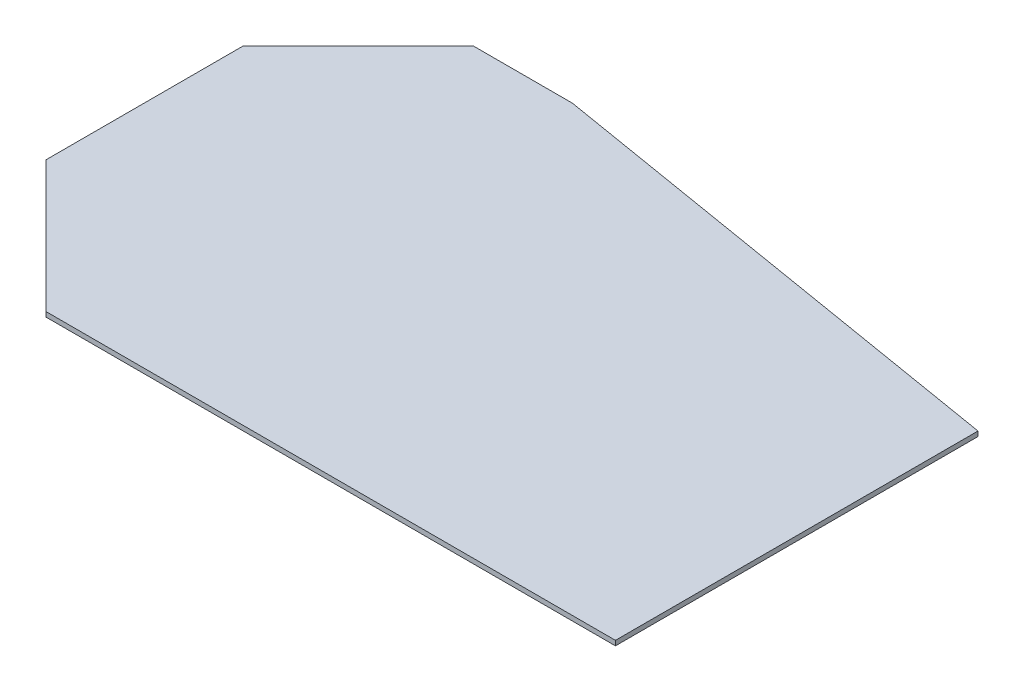
ISO-10303-21;
HEADER;
FILE_DESCRIPTION(('STEP AP214'),'2;1');
FILE_NAME('part.step','',(''),(''),'','','');
FILE_SCHEMA(('AUTOMOTIVE_DESIGN { 1 0 10303 214 1 1 1 1 }'));
ENDSEC;
DATA;
#1=APPLICATION_CONTEXT('core data for automotive mechanical design processes');
#2=APPLICATION_PROTOCOL_DEFINITION('international standard','automotive_design',2000,#1);
#3=PRODUCT_CONTEXT('',#1,'mechanical');
#4=PRODUCT('Part','Part','',(#3));
#5=PRODUCT_RELATED_PRODUCT_CATEGORY('part','',(#4));
#6=PRODUCT_DEFINITION_FORMATION('','',#4);
#7=PRODUCT_DEFINITION_CONTEXT('part definition',#1,'design');
#8=PRODUCT_DEFINITION('design','',#6,#7);
#9=PRODUCT_DEFINITION_SHAPE('','',#8);
#10=(LENGTH_UNIT() NAMED_UNIT(*) SI_UNIT(.MILLI.,.METRE.));
#11=(NAMED_UNIT(*) PLANE_ANGLE_UNIT() SI_UNIT($,.RADIAN.));
#12=(NAMED_UNIT(*) SI_UNIT($,.STERADIAN.) SOLID_ANGLE_UNIT());
#13=UNCERTAINTY_MEASURE_WITH_UNIT(LENGTH_MEASURE(1.E-05),#10,'distance_accuracy_value','');
#14=(GEOMETRIC_REPRESENTATION_CONTEXT(3) GLOBAL_UNCERTAINTY_ASSIGNED_CONTEXT((#13)) GLOBAL_UNIT_ASSIGNED_CONTEXT((#10,
#11,#12)) REPRESENTATION_CONTEXT('',''));
#15=CARTESIAN_POINT('',(0.,0.,0.));
#16=DIRECTION('',(0.,0.,1.));
#17=DIRECTION('',(1.,0.,0.));
#18=AXIS2_PLACEMENT_3D('',#15,#16,#17);
#19=CARTESIAN_POINT('',(0.,3.,-283.));
#20=DIRECTION('',(0.,0.,-1.));
#21=DIRECTION('',(-1.,0.,0.));
#22=AXIS2_PLACEMENT_3D('',#19,#20,#21);
#23=PLANE('',#22);
#24=DIRECTION('',(1.,0.,0.));
#25=VECTOR('',#24,1.);
#26=CARTESIAN_POINT('',(0.,0.,-283.));
#27=LINE('',#26,#25);
#28=CARTESIAN_POINT('',(103.75735931288,0.,-283.));
#29=VERTEX_POINT('',#28);
#30=CARTESIAN_POINT('',(165.248287590895,0.,-283.));
#31=VERTEX_POINT('',#30);
#32=EDGE_CURVE('E122',#29,#31,#27,.T.);
#33=ORIENTED_EDGE('',*,*,#32,.F.);
#34=DIRECTION('',(0.,-1.,0.));
#35=VECTOR('',#34,1.);
#36=CARTESIAN_POINT('',(103.75735931288,3.,-283.));
#37=LINE('',#36,#35);
#38=CARTESIAN_POINT('',(103.75735931288,3.,-283.));
#39=VERTEX_POINT('',#38);
#40=EDGE_CURVE('E11',#39,#29,#37,.T.);
#41=ORIENTED_EDGE('',*,*,#40,.F.);
#42=DIRECTION('',(1.,0.,0.));
#43=VECTOR('',#42,1.);
#44=CARTESIAN_POINT('',(0.,3.,-283.));
#45=LINE('',#44,#43);
#46=CARTESIAN_POINT('',(165.248287590895,3.,-283.));
#47=VERTEX_POINT('',#46);
#48=EDGE_CURVE('E138',#39,#47,#45,.T.);
#49=ORIENTED_EDGE('',*,*,#48,.T.);
#50=DIRECTION('',(0.,-1.,0.));
#51=VECTOR('',#50,1.);
#52=CARTESIAN_POINT('',(165.248287590895,3.,-283.));
#53=LINE('',#52,#51);
#54=EDGE_CURVE('E51',#47,#31,#53,.T.);
#55=ORIENTED_EDGE('',*,*,#54,.T.);
#56=EDGE_LOOP('',(#33,#41,#49,#55));
#57=FACE_BOUND('',#56,.T.);
#58=ADVANCED_FACE('F35',(#57),#23,.T.);
#59=CARTESIAN_POINT('',(-89.6213203435597,3.,-89.6213203435597));
#60=DIRECTION('',(0.707106781186547,0.,0.707106781186547));
#61=DIRECTION('',(0.707106781186548,0.,-0.707106781186548));
#62=AXIS2_PLACEMENT_3D('',#59,#60,#61);
#63=PLANE('',#62);
#64=DIRECTION('',(-0.707106781186548,0.,0.707106781186548));
#65=VECTOR('',#64,1.);
#66=CARTESIAN_POINT('',(-89.6213203435597,0.,-89.6213203435597));
#67=LINE('',#66,#65);
#68=CARTESIAN_POINT('',(32.,0.,-211.242640687119));
#69=VERTEX_POINT('',#68);
#70=EDGE_CURVE('E124',#29,#69,#67,.T.);
#71=ORIENTED_EDGE('',*,*,#70,.T.);
#72=DIRECTION('',(0.,-1.,0.));
#73=VECTOR('',#72,1.);
#74=CARTESIAN_POINT('',(32.,3.,-211.242640687119));
#75=LINE('',#74,#73);
#76=CARTESIAN_POINT('',(32.,3.,-211.242640687119));
#77=VERTEX_POINT('',#76);
#78=EDGE_CURVE('E43',#77,#69,#75,.T.);
#79=ORIENTED_EDGE('',*,*,#78,.F.);
#80=DIRECTION('',(-0.707106781186548,0.,0.707106781186548));
#81=VECTOR('',#80,1.);
#82=CARTESIAN_POINT('',(-89.6213203435597,3.,-89.6213203435597));
#83=LINE('',#82,#81);
#84=EDGE_CURVE('E158',#39,#77,#83,.T.);
#85=ORIENTED_EDGE('',*,*,#84,.F.);
#86=ORIENTED_EDGE('',*,*,#40,.T.);
#87=EDGE_LOOP('',(#71,#79,#85,#86));
#88=FACE_BOUND('',#87,.T.);
#89=ADVANCED_FACE('F173',(#88),#63,.F.);
#90=CARTESIAN_POINT('',(32.,3.,0.));
#91=DIRECTION('',(1.,0.,0.));
#92=DIRECTION('',(0.,0.,-1.));
#93=AXIS2_PLACEMENT_3D('',#90,#91,#92);
#94=PLANE('',#93);
#95=DIRECTION('',(0.,0.,1.));
#96=VECTOR('',#95,1.);
#97=CARTESIAN_POINT('',(32.,0.,0.));
#98=LINE('',#97,#96);
#99=CARTESIAN_POINT('',(32.,0.,-88.7573593128808));
#100=VERTEX_POINT('',#99);
#101=EDGE_CURVE('E126',#69,#100,#98,.T.);
#102=ORIENTED_EDGE('',*,*,#101,.T.);
#103=DIRECTION('',(0.,-1.,0.));
#104=VECTOR('',#103,1.);
#105=CARTESIAN_POINT('',(32.,3.,-88.7573593128808));
#106=LINE('',#105,#104);
#107=CARTESIAN_POINT('',(32.,3.,-88.7573593128808));
#108=VERTEX_POINT('',#107);
#109=EDGE_CURVE('E142',#108,#100,#106,.T.);
#110=ORIENTED_EDGE('',*,*,#109,.F.);
#111=DIRECTION('',(0.,0.,1.));
#112=VECTOR('',#111,1.);
#113=CARTESIAN_POINT('',(32.,3.,0.));
#114=LINE('',#113,#112);
#115=EDGE_CURVE('E150',#77,#108,#114,.T.);
#116=ORIENTED_EDGE('',*,*,#115,.F.);
#117=ORIENTED_EDGE('',*,*,#78,.T.);
#118=EDGE_LOOP('',(#102,#110,#116,#117));
#119=FACE_BOUND('',#118,.T.);
#120=ADVANCED_FACE('F148',(#119),#94,.F.);
#121=CARTESIAN_POINT('',(60.3786796564404,3.,-60.3786796564404));
#122=DIRECTION('',(-0.707106781186548,0.,0.707106781186547));
#123=DIRECTION('',(0.707106781186547,0.,0.707106781186548));
#124=AXIS2_PLACEMENT_3D('',#121,#122,#123);
#125=PLANE('',#124);
#126=DIRECTION('',(-0.707106781186547,0.,-0.707106781186548));
#127=VECTOR('',#126,1.);
#128=CARTESIAN_POINT('',(60.3786796564404,0.,-60.3786796564404));
#129=LINE('',#128,#127);
#130=CARTESIAN_POINT('',(113.757359312881,0.,-7.));
#131=VERTEX_POINT('',#130);
#132=EDGE_CURVE('E129',#131,#100,#129,.T.);
#133=ORIENTED_EDGE('',*,*,#132,.F.);
#134=DIRECTION('',(0.,-1.,0.));
#135=VECTOR('',#134,1.);
#136=CARTESIAN_POINT('',(113.757359312881,3.,-7.));
#137=LINE('',#136,#135);
#138=CARTESIAN_POINT('',(113.757359312881,3.,-7.));
#139=VERTEX_POINT('',#138);
#140=EDGE_CURVE('E114',#139,#131,#137,.T.);
#141=ORIENTED_EDGE('',*,*,#140,.F.);
#142=DIRECTION('',(-0.707106781186547,0.,-0.707106781186548));
#143=VECTOR('',#142,1.);
#144=CARTESIAN_POINT('',(60.3786796564404,3.,-60.3786796564404));
#145=LINE('',#144,#143);
#146=EDGE_CURVE('E104',#139,#108,#145,.T.);
#147=ORIENTED_EDGE('',*,*,#146,.T.);
#148=ORIENTED_EDGE('',*,*,#109,.T.);
#149=EDGE_LOOP('',(#133,#141,#147,#148));
#150=FACE_BOUND('',#149,.T.);
#151=ADVANCED_FACE('F157',(#150),#125,.T.);
#152=CARTESIAN_POINT('',(0.,3.,-7.));
#153=DIRECTION('',(0.,0.,-1.));
#154=DIRECTION('',(-1.,0.,0.));
#155=AXIS2_PLACEMENT_3D('',#152,#153,#154);
#156=PLANE('',#155);
#157=DIRECTION('',(1.,0.,0.));
#158=VECTOR('',#157,1.);
#159=CARTESIAN_POINT('',(0.,0.,-7.));
#160=LINE('',#159,#158);
#161=CARTESIAN_POINT('',(468.,0.,-7.));
#162=VERTEX_POINT('',#161);
#163=EDGE_CURVE('E111',#131,#162,#160,.T.);
#164=ORIENTED_EDGE('',*,*,#163,.T.);
#165=DIRECTION('',(0.,-1.,0.));
#166=VECTOR('',#165,1.);
#167=CARTESIAN_POINT('',(468.,3.,-7.));
#168=LINE('',#167,#166);
#169=CARTESIAN_POINT('',(468.,3.,-7.));
#170=VERTEX_POINT('',#169);
#171=EDGE_CURVE('E108',#170,#162,#168,.T.);
#172=ORIENTED_EDGE('',*,*,#171,.F.);
#173=DIRECTION('',(1.,0.,0.));
#174=VECTOR('',#173,1.);
#175=CARTESIAN_POINT('',(0.,3.,-7.));
#176=LINE('',#175,#174);
#177=EDGE_CURVE('E96',#139,#170,#176,.T.);
#178=ORIENTED_EDGE('',*,*,#177,.F.);
#179=ORIENTED_EDGE('',*,*,#140,.T.);
#180=EDGE_LOOP('',(#164,#172,#178,#179));
#181=FACE_BOUND('',#180,.T.);
#182=ADVANCED_FACE('F109',(#181),#156,.F.);
#183=CARTESIAN_POINT('',(468.,3.,0.));
#184=DIRECTION('',(1.,0.,0.));
#185=DIRECTION('',(0.,0.,-1.));
#186=AXIS2_PLACEMENT_3D('',#183,#184,#185);
#187=PLANE('',#186);
#188=DIRECTION('',(0.,0.,1.));
#189=VECTOR('',#188,1.);
#190=CARTESIAN_POINT('',(468.,0.,0.));
#191=LINE('',#190,#189);
#192=CARTESIAN_POINT('',(468.,0.,-232.541381265149));
#193=VERTEX_POINT('',#192);
#194=EDGE_CURVE('E133',#193,#162,#191,.T.);
#195=ORIENTED_EDGE('',*,*,#194,.F.);
#196=DIRECTION('',(0.,-1.,0.));
#197=VECTOR('',#196,1.);
#198=CARTESIAN_POINT('',(468.,3.,-232.541381265149));
#199=LINE('',#198,#197);
#200=CARTESIAN_POINT('',(468.,3.,-232.541381265149));
#201=VERTEX_POINT('',#200);
#202=EDGE_CURVE('E73',#201,#193,#199,.T.);
#203=ORIENTED_EDGE('',*,*,#202,.F.);
#204=DIRECTION('',(0.,0.,1.));
#205=VECTOR('',#204,1.);
#206=CARTESIAN_POINT('',(468.,3.,0.));
#207=LINE('',#206,#205);
#208=EDGE_CURVE('E102',#201,#170,#207,.T.);
#209=ORIENTED_EDGE('',*,*,#208,.T.);
#210=ORIENTED_EDGE('',*,*,#171,.T.);
#211=EDGE_LOOP('',(#195,#203,#209,#210));
#212=FACE_BOUND('',#211,.T.);
#213=ADVANCED_FACE('F116',(#212),#187,.T.);
#214=CARTESIAN_POINT('',(50.3580618267807,3.,-302.148370960686));
#215=DIRECTION('',(0.164398987305357,0.,-0.986393923832144));
#216=DIRECTION('',(-0.986393923832144,0.,-0.164398987305357));
#217=AXIS2_PLACEMENT_3D('',#214,#215,#216);
#218=PLANE('',#217);
#219=DIRECTION('',(0.986393923832144,0.,0.164398987305357));
#220=VECTOR('',#219,1.);
#221=CARTESIAN_POINT('',(50.3580618267807,0.,-302.148370960686));
#222=LINE('',#221,#220);
#223=EDGE_CURVE('E135',#31,#193,#222,.T.);
#224=ORIENTED_EDGE('',*,*,#223,.F.);
#225=ORIENTED_EDGE('',*,*,#54,.F.);
#226=DIRECTION('',(0.986393923832144,0.,0.164398987305357));
#227=VECTOR('',#226,1.);
#228=CARTESIAN_POINT('',(50.3580618267807,3.,-302.148370960686));
#229=LINE('',#228,#227);
#230=EDGE_CURVE('E117',#47,#201,#229,.T.);
#231=ORIENTED_EDGE('',*,*,#230,.T.);
#232=ORIENTED_EDGE('',*,*,#202,.T.);
#233=EDGE_LOOP('',(#224,#225,#231,#232));
#234=FACE_BOUND('',#233,.T.);
#235=ADVANCED_FACE('F162',(#234),#218,.T.);
#236=CARTESIAN_POINT('',(0.,3.,0.));
#237=DIRECTION('',(0.,1.,0.));
#238=DIRECTION('',(0.,0.,1.));
#239=AXIS2_PLACEMENT_3D('',#236,#237,#238);
#240=PLANE('',#239);
#241=ORIENTED_EDGE('',*,*,#48,.F.);
#242=ORIENTED_EDGE('',*,*,#84,.T.);
#243=ORIENTED_EDGE('',*,*,#115,.T.);
#244=ORIENTED_EDGE('',*,*,#146,.F.);
#245=ORIENTED_EDGE('',*,*,#177,.T.);
#246=ORIENTED_EDGE('',*,*,#208,.F.);
#247=ORIENTED_EDGE('',*,*,#230,.F.);
#248=EDGE_LOOP('',(#241,#242,#243,#244,#245,#246,#247));
#249=FACE_BOUND('',#248,.T.);
#250=ADVANCED_FACE('F99',(#249),#240,.T.);
#251=CARTESIAN_POINT('',(0.,0.,0.));
#252=DIRECTION('',(0.,1.,0.));
#253=DIRECTION('',(0.,0.,1.));
#254=AXIS2_PLACEMENT_3D('',#251,#252,#253);
#255=PLANE('',#254);
#256=ORIENTED_EDGE('',*,*,#32,.T.);
#257=ORIENTED_EDGE('',*,*,#223,.T.);
#258=ORIENTED_EDGE('',*,*,#194,.T.);
#259=ORIENTED_EDGE('',*,*,#163,.F.);
#260=ORIENTED_EDGE('',*,*,#132,.T.);
#261=ORIENTED_EDGE('',*,*,#101,.F.);
#262=ORIENTED_EDGE('',*,*,#70,.F.);
#263=EDGE_LOOP('',(#256,#257,#258,#259,#260,#261,#262));
#264=FACE_BOUND('',#263,.T.);
#265=ADVANCED_FACE('F154',(#264),#255,.F.);
#266=CLOSED_SHELL('',(#58,#89,#120,#151,#182,#213,#235,#250,#265));
#267=MANIFOLD_SOLID_BREP('B2',#266);
#268=ADVANCED_BREP_SHAPE_REPRESENTATION('',(#18,#267),#14);
#269=SHAPE_DEFINITION_REPRESENTATION(#9,#268);
ENDSEC;
END-ISO-10303-21;
